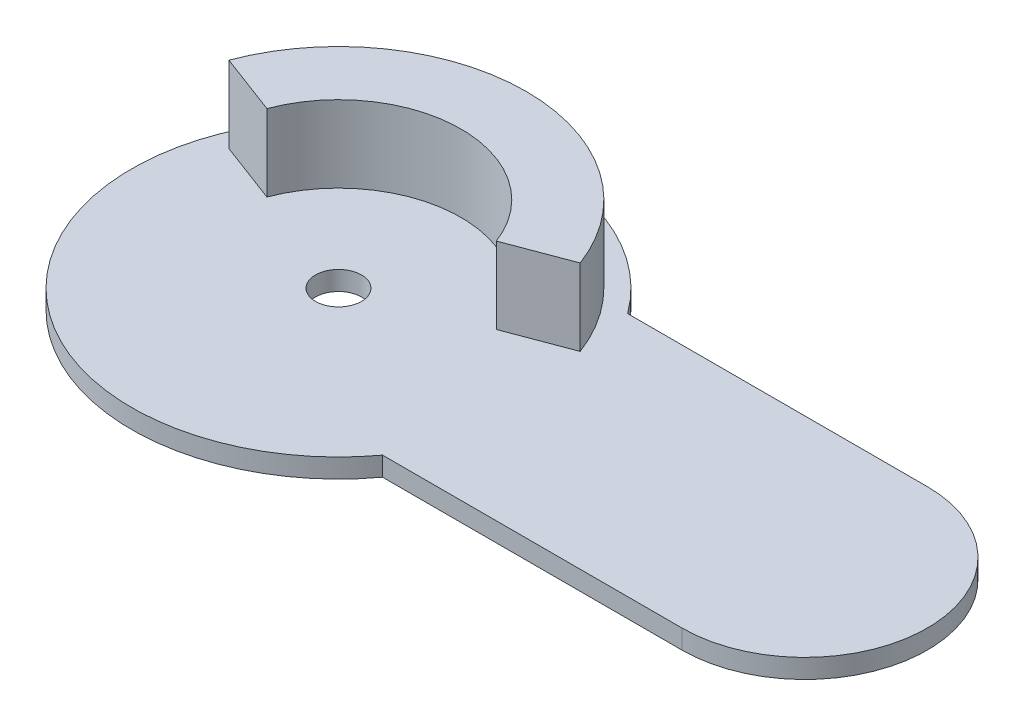
ISO-10303-21;
HEADER;
FILE_DESCRIPTION(('STEP AP214'),'2;1');
FILE_NAME('part.step','',(''),(''),'','','');
FILE_SCHEMA(('AUTOMOTIVE_DESIGN { 1 0 10303 214 1 1 1 1 }'));
ENDSEC;
DATA;
#1=APPLICATION_CONTEXT('core data for automotive mechanical design processes');
#2=APPLICATION_PROTOCOL_DEFINITION('international standard','automotive_design',2000,#1);
#3=PRODUCT_CONTEXT('',#1,'mechanical');
#4=PRODUCT('Part','Part','',(#3));
#5=PRODUCT_RELATED_PRODUCT_CATEGORY('part','',(#4));
#6=PRODUCT_DEFINITION_FORMATION('','',#4);
#7=PRODUCT_DEFINITION_CONTEXT('part definition',#1,'design');
#8=PRODUCT_DEFINITION('design','',#6,#7);
#9=PRODUCT_DEFINITION_SHAPE('','',#8);
#10=(LENGTH_UNIT() NAMED_UNIT(*) SI_UNIT(.MILLI.,.METRE.));
#11=(NAMED_UNIT(*) PLANE_ANGLE_UNIT() SI_UNIT($,.RADIAN.));
#12=(NAMED_UNIT(*) SI_UNIT($,.STERADIAN.) SOLID_ANGLE_UNIT());
#13=UNCERTAINTY_MEASURE_WITH_UNIT(LENGTH_MEASURE(1.E-05),#10,'distance_accuracy_value','');
#14=(GEOMETRIC_REPRESENTATION_CONTEXT(3) GLOBAL_UNCERTAINTY_ASSIGNED_CONTEXT((#13)) GLOBAL_UNIT_ASSIGNED_CONTEXT((#10,
#11,#12)) REPRESENTATION_CONTEXT('',''));
#15=CARTESIAN_POINT('',(0.,0.,0.));
#16=DIRECTION('',(0.,0.,1.));
#17=DIRECTION('',(1.,0.,0.));
#18=AXIS2_PLACEMENT_3D('',#15,#16,#17);
#19=CARTESIAN_POINT('',(-2.46330733588707E-13,0.,4.85722573273506E-13));
#20=DIRECTION('',(0.,1.,0.));
#21=DIRECTION('',(0.,0.,1.));
#22=AXIS2_PLACEMENT_3D('',#19,#20,#21);
#23=PLANE('',#22);
#24=CARTESIAN_POINT('',(0.,0.,0.));
#25=DIRECTION('',(0.,-1.,0.));
#26=DIRECTION('',(0.,0.,-1.));
#27=AXIS2_PLACEMENT_3D('',#24,#25,#26);
#28=CIRCLE('',#27,3.);
#29=CARTESIAN_POINT('',(0.,0.,-3.));
#30=VERTEX_POINT('',#29);
#31=EDGE_CURVE('E237',#30,#30,#28,.T.);
#32=ORIENTED_EDGE('',*,*,#31,.T.);
#33=EDGE_LOOP('',(#32));
#34=FACE_BOUND('',#33,.T.);
#35=DIRECTION('',(0.935962851496357,0.,0.352098765432098));
#36=VECTOR('',#35,1.);
#37=CARTESIAN_POINT('',(-22.9310898616607,0.,-8.62641975308642));
#38=LINE('',#37,#36);
#39=CARTESIAN_POINT('',(-22.9310898616607,0.,-8.62641975308642));
#40=VERTEX_POINT('',#39);
#41=CARTESIAN_POINT('',(-14.9754056239417,0.,-5.63358024691358));
#42=VERTEX_POINT('',#41);
#43=EDGE_CURVE('E138',#40,#42,#38,.T.);
#44=ORIENTED_EDGE('',*,*,#43,.F.);
#45=CARTESIAN_POINT('',(0.,0.,1.28369537222284E-13));
#46=DIRECTION('',(0.,-1.,0.));
#47=DIRECTION('',(0.,0.,-1.));
#48=AXIS2_PLACEMENT_3D('',#45,#46,#47);
#49=CIRCLE('',#48,24.5);
#50=CARTESIAN_POINT('',(22.9310898616607,0.,-8.62641975308642));
#51=VERTEX_POINT('',#50);
#52=EDGE_CURVE('E144',#40,#51,#49,.T.);
#53=ORIENTED_EDGE('',*,*,#52,.T.);
#54=DIRECTION('',(-0.935962851496357,0.,0.352098765432098));
#55=VECTOR('',#54,1.);
#56=CARTESIAN_POINT('',(22.9310898616607,0.,-8.62641975308642));
#57=LINE('',#56,#55);
#58=CARTESIAN_POINT('',(14.9754056239417,0.,-5.63358024691358));
#59=VERTEX_POINT('',#58);
#60=EDGE_CURVE('E161',#51,#59,#57,.T.);
#61=ORIENTED_EDGE('',*,*,#60,.T.);
#62=CARTESIAN_POINT('',(0.,0.,0.));
#63=DIRECTION('',(0.,-1.,0.));
#64=DIRECTION('',(0.,0.,-1.));
#65=AXIS2_PLACEMENT_3D('',#62,#63,#64);
#66=CIRCLE('',#65,16.);
#67=EDGE_CURVE('E157',#42,#59,#66,.T.);
#68=ORIENTED_EDGE('',*,*,#67,.F.);
#69=EDGE_LOOP('',(#44,#53,#61,#68));
#70=FACE_BOUND('',#69,.T.);
#71=DIRECTION('',(-1.,0.,0.));
#72=VECTOR('',#71,1.);
#73=CARTESIAN_POINT('',(21.7485631709316,0.,16.));
#74=LINE('',#73,#72);
#75=CARTESIAN_POINT('',(60.8704274111471,0.,16.));
#76=VERTEX_POINT('',#75);
#77=CARTESIAN_POINT('',(21.7485631709316,0.,16.));
#78=VERTEX_POINT('',#77);
#79=EDGE_CURVE('E115',#76,#78,#74,.T.);
#80=ORIENTED_EDGE('',*,*,#79,.F.);
#81=CARTESIAN_POINT('',(60.8704274111471,0.,0.));
#82=DIRECTION('',(0.,1.,0.));
#83=DIRECTION('',(0.,0.,1.));
#84=AXIS2_PLACEMENT_3D('',#81,#82,#83);
#85=CIRCLE('',#84,16.);
#86=CARTESIAN_POINT('',(60.8704274111471,0.,-16.));
#87=VERTEX_POINT('',#86);
#88=EDGE_CURVE('E100',#87,#76,#85,.F.);
#89=ORIENTED_EDGE('',*,*,#88,.F.);
#90=DIRECTION('',(1.,0.,0.));
#91=VECTOR('',#90,1.);
#92=CARTESIAN_POINT('',(21.7485631709316,0.,-16.));
#93=LINE('',#92,#91);
#94=CARTESIAN_POINT('',(21.7485631709316,0.,-16.));
#95=VERTEX_POINT('',#94);
#96=EDGE_CURVE('E121',#95,#87,#93,.T.);
#97=ORIENTED_EDGE('',*,*,#96,.F.);
#98=CARTESIAN_POINT('',(0.,0.,0.));
#99=DIRECTION('',(0.,-1.,0.));
#100=DIRECTION('',(0.,0.,1.));
#101=AXIS2_PLACEMENT_3D('',#98,#99,#100);
#102=CIRCLE('',#101,27.);
#103=EDGE_CURVE('E118',#78,#95,#102,.T.);
#104=ORIENTED_EDGE('',*,*,#103,.F.);
#105=EDGE_LOOP('',(#80,#89,#97,#104));
#106=FACE_BOUND('',#105,.T.);
#107=ADVANCED_FACE('F38',(#34,#70,#106),#23,.T.);
#108=CARTESIAN_POINT('',(-2.46330733588707E-13,-2.5,4.85722573273506E-13));
#109=DIRECTION('',(0.,1.,0.));
#110=DIRECTION('',(0.,0.,1.));
#111=AXIS2_PLACEMENT_3D('',#108,#109,#110);
#112=PLANE('',#111);
#113=CARTESIAN_POINT('',(0.,-2.5,0.));
#114=DIRECTION('',(0.,-1.,0.));
#115=DIRECTION('',(0.,0.,-1.));
#116=AXIS2_PLACEMENT_3D('',#113,#114,#115);
#117=CIRCLE('',#116,3.);
#118=CARTESIAN_POINT('',(0.,-2.5,-3.));
#119=VERTEX_POINT('',#118);
#120=EDGE_CURVE('E127',#119,#119,#117,.T.);
#121=ORIENTED_EDGE('',*,*,#120,.F.);
#122=EDGE_LOOP('',(#121));
#123=FACE_BOUND('',#122,.T.);
#124=CARTESIAN_POINT('',(60.8704274111471,-2.5,0.));
#125=DIRECTION('',(0.,1.,0.));
#126=DIRECTION('',(0.,0.,1.));
#127=AXIS2_PLACEMENT_3D('',#124,#125,#126);
#128=CIRCLE('',#127,16.);
#129=CARTESIAN_POINT('',(60.8704274111471,-2.5,-16.));
#130=VERTEX_POINT('',#129);
#131=CARTESIAN_POINT('',(60.8704274111471,-2.5,16.));
#132=VERTEX_POINT('',#131);
#133=EDGE_CURVE('E240',#130,#132,#128,.F.);
#134=ORIENTED_EDGE('',*,*,#133,.T.);
#135=DIRECTION('',(-1.,0.,0.));
#136=VECTOR('',#135,1.);
#137=CARTESIAN_POINT('',(21.7485631709316,-2.5,16.));
#138=LINE('',#137,#136);
#139=CARTESIAN_POINT('',(21.7485631709316,-2.5,16.));
#140=VERTEX_POINT('',#139);
#141=EDGE_CURVE('E117',#132,#140,#138,.T.);
#142=ORIENTED_EDGE('',*,*,#141,.T.);
#143=CARTESIAN_POINT('',(-2.46330733588707E-13,-2.5,4.85722573273506E-13));
#144=DIRECTION('',(0.,-1.,0.));
#145=DIRECTION('',(0.,0.,1.));
#146=AXIS2_PLACEMENT_3D('',#143,#144,#145);
#147=CIRCLE('',#146,27.0000000000005);
#148=CARTESIAN_POINT('',(21.7485631709316,-2.5,-16.));
#149=VERTEX_POINT('',#148);
#150=EDGE_CURVE('E125',#140,#149,#147,.T.);
#151=ORIENTED_EDGE('',*,*,#150,.T.);
#152=DIRECTION('',(1.,0.,0.));
#153=VECTOR('',#152,1.);
#154=CARTESIAN_POINT('',(21.7485631709316,-2.5,-16.));
#155=LINE('',#154,#153);
#156=EDGE_CURVE('E228',#149,#130,#155,.T.);
#157=ORIENTED_EDGE('',*,*,#156,.T.);
#158=EDGE_LOOP('',(#134,#142,#151,#157));
#159=FACE_BOUND('',#158,.T.);
#160=ADVANCED_FACE('F202',(#123,#159),#112,.F.);
#161=CARTESIAN_POINT('',(21.7485631709316,-2.5,16.));
#162=DIRECTION('',(0.,0.,-1.));
#163=DIRECTION('',(-1.,0.,0.));
#164=AXIS2_PLACEMENT_3D('',#161,#162,#163);
#165=PLANE('',#164);
#166=DIRECTION('',(0.,1.,0.));
#167=VECTOR('',#166,1.);
#168=CARTESIAN_POINT('',(60.8704274111471,-10.,16.));
#169=LINE('',#168,#167);
#170=EDGE_CURVE('E11',#76,#132,#169,.F.);
#171=ORIENTED_EDGE('',*,*,#170,.F.);
#172=ORIENTED_EDGE('',*,*,#79,.T.);
#173=DIRECTION('',(0.,1.,0.));
#174=VECTOR('',#173,1.);
#175=CARTESIAN_POINT('',(21.7485631709316,-2.5,16.));
#176=LINE('',#175,#174);
#177=EDGE_CURVE('E131',#140,#78,#176,.T.);
#178=ORIENTED_EDGE('',*,*,#177,.F.);
#179=ORIENTED_EDGE('',*,*,#141,.F.);
#180=EDGE_LOOP('',(#171,#172,#178,#179));
#181=FACE_BOUND('',#180,.T.);
#182=ADVANCED_FACE('F113',(#181),#165,.F.);
#183=CARTESIAN_POINT('',(-22.9310898616607,10.,-8.62641975308642));
#184=DIRECTION('',(0.352098765432098,0.,-0.935962851496357));
#185=DIRECTION('',(-0.935962851496357,0.,-0.352098765432098));
#186=AXIS2_PLACEMENT_3D('',#183,#184,#185);
#187=PLANE('',#186);
#188=ORIENTED_EDGE('',*,*,#43,.T.);
#189=DIRECTION('',(0.,-1.,0.));
#190=VECTOR('',#189,1.);
#191=CARTESIAN_POINT('',(-14.9754056239417,10.,-5.63358024691358));
#192=LINE('',#191,#190);
#193=CARTESIAN_POINT('',(-14.9754056239417,10.,-5.63358024691358));
#194=VERTEX_POINT('',#193);
#195=EDGE_CURVE('E48',#194,#42,#192,.T.);
#196=ORIENTED_EDGE('',*,*,#195,.F.);
#197=DIRECTION('',(0.935962851496357,0.,0.352098765432098));
#198=VECTOR('',#197,1.);
#199=CARTESIAN_POINT('',(-22.9310898616607,10.,-8.62641975308642));
#200=LINE('',#199,#198);
#201=CARTESIAN_POINT('',(-22.9310898616607,10.,-8.62641975308642));
#202=VERTEX_POINT('',#201);
#203=EDGE_CURVE('E139',#202,#194,#200,.T.);
#204=ORIENTED_EDGE('',*,*,#203,.F.);
#205=DIRECTION('',(0.,-1.,0.));
#206=VECTOR('',#205,1.);
#207=CARTESIAN_POINT('',(-22.9310898616607,10.,-8.62641975308642));
#208=LINE('',#207,#206);
#209=EDGE_CURVE('E55',#202,#40,#208,.T.);
#210=ORIENTED_EDGE('',*,*,#209,.T.);
#211=EDGE_LOOP('',(#188,#196,#204,#210));
#212=FACE_BOUND('',#211,.T.);
#213=ADVANCED_FACE('F40',(#212),#187,.F.);
#214=CARTESIAN_POINT('',(0.,10.,0.));
#215=DIRECTION('',(0.,-1.,0.));
#216=DIRECTION('',(0.,0.,-1.));
#217=AXIS2_PLACEMENT_3D('',#214,#215,#216);
#218=CYLINDRICAL_SURFACE('',#217,16.);
#219=ORIENTED_EDGE('',*,*,#67,.T.);
#220=DIRECTION('',(0.,-1.,0.));
#221=VECTOR('',#220,1.);
#222=CARTESIAN_POINT('',(14.9754056239417,10.,-5.63358024691358));
#223=LINE('',#222,#221);
#224=CARTESIAN_POINT('',(14.9754056239417,10.,-5.63358024691358));
#225=VERTEX_POINT('',#224);
#226=EDGE_CURVE('E173',#225,#59,#223,.T.);
#227=ORIENTED_EDGE('',*,*,#226,.F.);
#228=CARTESIAN_POINT('',(0.,10.,0.));
#229=DIRECTION('',(0.,-1.,0.));
#230=DIRECTION('',(0.,0.,-1.));
#231=AXIS2_PLACEMENT_3D('',#228,#229,#230);
#232=CIRCLE('',#231,16.);
#233=EDGE_CURVE('E143',#194,#225,#232,.T.);
#234=ORIENTED_EDGE('',*,*,#233,.F.);
#235=ORIENTED_EDGE('',*,*,#195,.T.);
#236=EDGE_LOOP('',(#219,#227,#234,#235));
#237=FACE_BOUND('',#236,.T.);
#238=ADVANCED_FACE('F180',(#237),#218,.F.);
#239=CARTESIAN_POINT('',(22.9310898616607,10.,-8.62641975308642));
#240=DIRECTION('',(0.352098765432098,0.,0.935962851496357));
#241=DIRECTION('',(0.935962851496357,0.,-0.352098765432098));
#242=AXIS2_PLACEMENT_3D('',#239,#240,#241);
#243=PLANE('',#242);
#244=ORIENTED_EDGE('',*,*,#60,.F.);
#245=DIRECTION('',(0.,-1.,0.));
#246=VECTOR('',#245,1.);
#247=CARTESIAN_POINT('',(22.9310898616607,10.,-8.62641975308642));
#248=LINE('',#247,#246);
#249=CARTESIAN_POINT('',(22.9310898616607,10.,-8.62641975308642));
#250=VERTEX_POINT('',#249);
#251=EDGE_CURVE('E169',#250,#51,#248,.T.);
#252=ORIENTED_EDGE('',*,*,#251,.F.);
#253=DIRECTION('',(-0.935962851496357,0.,0.352098765432098));
#254=VECTOR('',#253,1.);
#255=CARTESIAN_POINT('',(22.9310898616607,10.,-8.62641975308642));
#256=LINE('',#255,#254);
#257=EDGE_CURVE('E147',#250,#225,#256,.T.);
#258=ORIENTED_EDGE('',*,*,#257,.T.);
#259=ORIENTED_EDGE('',*,*,#226,.T.);
#260=EDGE_LOOP('',(#244,#252,#258,#259));
#261=FACE_BOUND('',#260,.T.);
#262=ADVANCED_FACE('F186',(#261),#243,.T.);
#263=CARTESIAN_POINT('',(0.,10.,1.28369537222284E-13));
#264=DIRECTION('',(0.,-1.,0.));
#265=DIRECTION('',(0.,0.,-1.));
#266=AXIS2_PLACEMENT_3D('',#263,#264,#265);
#267=CYLINDRICAL_SURFACE('',#266,24.5);
#268=ORIENTED_EDGE('',*,*,#52,.F.);
#269=ORIENTED_EDGE('',*,*,#209,.F.);
#270=CARTESIAN_POINT('',(0.,10.,1.28369537222284E-13));
#271=DIRECTION('',(0.,-1.,0.));
#272=DIRECTION('',(0.,0.,-1.));
#273=AXIS2_PLACEMENT_3D('',#270,#271,#272);
#274=CIRCLE('',#273,24.5);
#275=EDGE_CURVE('E151',#202,#250,#274,.T.);
#276=ORIENTED_EDGE('',*,*,#275,.T.);
#277=ORIENTED_EDGE('',*,*,#251,.T.);
#278=EDGE_LOOP('',(#268,#269,#276,#277));
#279=FACE_BOUND('',#278,.T.);
#280=ADVANCED_FACE('F191',(#279),#267,.T.);
#281=CARTESIAN_POINT('',(0.,10.,0.));
#282=DIRECTION('',(0.,-1.,0.));
#283=DIRECTION('',(0.,0.,-1.));
#284=AXIS2_PLACEMENT_3D('',#281,#282,#283);
#285=PLANE('',#284);
#286=ORIENTED_EDGE('',*,*,#203,.T.);
#287=ORIENTED_EDGE('',*,*,#233,.T.);
#288=ORIENTED_EDGE('',*,*,#257,.F.);
#289=ORIENTED_EDGE('',*,*,#275,.F.);
#290=EDGE_LOOP('',(#286,#287,#288,#289));
#291=FACE_BOUND('',#290,.T.);
#292=ADVANCED_FACE('F190',(#291),#285,.F.);
#293=CARTESIAN_POINT('',(21.7485631709316,-2.5,-16.));
#294=DIRECTION('',(0.,0.,1.));
#295=DIRECTION('',(1.,0.,0.));
#296=AXIS2_PLACEMENT_3D('',#293,#294,#295);
#297=PLANE('',#296);
#298=ORIENTED_EDGE('',*,*,#96,.T.);
#299=DIRECTION('',(0.,1.,0.));
#300=VECTOR('',#299,1.);
#301=CARTESIAN_POINT('',(60.8704274111471,-10.,-16.));
#302=LINE('',#301,#300);
#303=EDGE_CURVE('E105',#130,#87,#302,.T.);
#304=ORIENTED_EDGE('',*,*,#303,.F.);
#305=ORIENTED_EDGE('',*,*,#156,.F.);
#306=DIRECTION('',(0.,1.,0.));
#307=VECTOR('',#306,1.);
#308=CARTESIAN_POINT('',(21.7485631709316,-2.5,-16.));
#309=LINE('',#308,#307);
#310=EDGE_CURVE('E134',#149,#95,#309,.T.);
#311=ORIENTED_EDGE('',*,*,#310,.T.);
#312=EDGE_LOOP('',(#298,#304,#305,#311));
#313=FACE_BOUND('',#312,.T.);
#314=ADVANCED_FACE('F198',(#313),#297,.F.);
#315=CARTESIAN_POINT('',(0.,-2.5,0.));
#316=DIRECTION('',(0.,1.,0.));
#317=DIRECTION('',(0.,0.,1.));
#318=AXIS2_PLACEMENT_3D('',#315,#316,#317);
#319=CYLINDRICAL_SURFACE('',#318,27.);
#320=ORIENTED_EDGE('',*,*,#103,.T.);
#321=ORIENTED_EDGE('',*,*,#310,.F.);
#322=ORIENTED_EDGE('',*,*,#150,.F.);
#323=ORIENTED_EDGE('',*,*,#177,.T.);
#324=EDGE_LOOP('',(#320,#321,#322,#323));
#325=FACE_BOUND('',#324,.T.);
#326=ADVANCED_FACE('F214',(#325),#319,.T.);
#327=CARTESIAN_POINT('',(0.,-2.5,0.));
#328=DIRECTION('',(0.,1.,0.));
#329=DIRECTION('',(0.,0.,1.));
#330=AXIS2_PLACEMENT_3D('',#327,#328,#329);
#331=CYLINDRICAL_SURFACE('',#330,3.);
#332=ORIENTED_EDGE('',*,*,#120,.T.);
#333=EDGE_LOOP('',(#332));
#334=FACE_BOUND('',#333,.T.);
#335=ORIENTED_EDGE('',*,*,#31,.F.);
#336=EDGE_LOOP('',(#335));
#337=FACE_BOUND('',#336,.T.);
#338=ADVANCED_FACE('F217',(#334,#337),#331,.F.);
#339=CARTESIAN_POINT('',(60.8704274111471,-10.,0.));
#340=DIRECTION('',(0.,1.,0.));
#341=DIRECTION('',(0.,0.,1.));
#342=AXIS2_PLACEMENT_3D('',#339,#340,#341);
#343=CYLINDRICAL_SURFACE('',#342,16.);
#344=ORIENTED_EDGE('',*,*,#303,.T.);
#345=ORIENTED_EDGE('',*,*,#88,.T.);
#346=ORIENTED_EDGE('',*,*,#170,.T.);
#347=ORIENTED_EDGE('',*,*,#133,.F.);
#348=EDGE_LOOP('',(#344,#345,#346,#347));
#349=FACE_BOUND('',#348,.T.);
#350=ADVANCED_FACE('F102',(#349),#343,.T.);
#351=CLOSED_SHELL('',(#107,#160,#182,#213,#238,#262,#280,#292,#314,#326,#338,#350));
#352=MANIFOLD_SOLID_BREP('B2',#351);
#353=ADVANCED_BREP_SHAPE_REPRESENTATION('',(#18,#352),#14);
#354=SHAPE_DEFINITION_REPRESENTATION(#9,#353);
ENDSEC;
END-ISO-10303-21;
